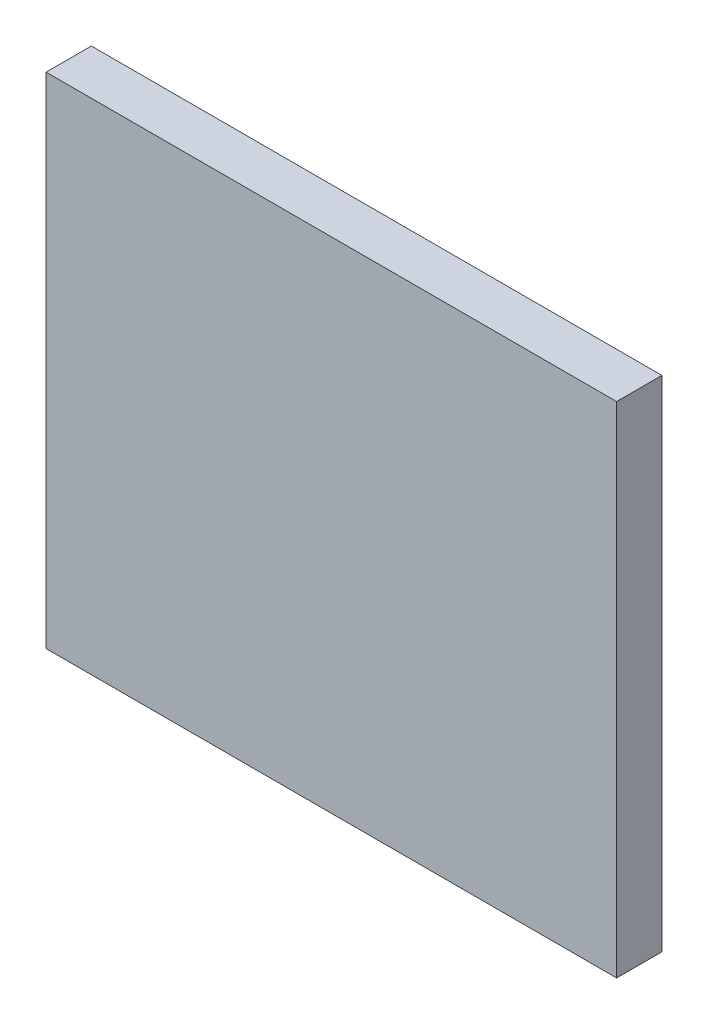
ISO-10303-21;
HEADER;
FILE_DESCRIPTION(('STEP AP214'),'2;1');
FILE_NAME('part.step','',(''),(''),'','','');
FILE_SCHEMA(('AUTOMOTIVE_DESIGN { 1 0 10303 214 1 1 1 1 }'));
ENDSEC;
DATA;
#1=APPLICATION_CONTEXT('core data for automotive mechanical design processes');
#2=APPLICATION_PROTOCOL_DEFINITION('international standard','automotive_design',2000,#1);
#3=PRODUCT_CONTEXT('',#1,'mechanical');
#4=PRODUCT('Part','Part','',(#3));
#5=PRODUCT_RELATED_PRODUCT_CATEGORY('part','',(#4));
#6=PRODUCT_DEFINITION_FORMATION('','',#4);
#7=PRODUCT_DEFINITION_CONTEXT('part definition',#1,'design');
#8=PRODUCT_DEFINITION('design','',#6,#7);
#9=PRODUCT_DEFINITION_SHAPE('','',#8);
#10=(LENGTH_UNIT() NAMED_UNIT(*) SI_UNIT(.MILLI.,.METRE.));
#11=(NAMED_UNIT(*) PLANE_ANGLE_UNIT() SI_UNIT($,.RADIAN.));
#12=(NAMED_UNIT(*) SI_UNIT($,.STERADIAN.) SOLID_ANGLE_UNIT());
#13=UNCERTAINTY_MEASURE_WITH_UNIT(LENGTH_MEASURE(1.E-05),#10,'distance_accuracy_value','');
#14=(GEOMETRIC_REPRESENTATION_CONTEXT(3) GLOBAL_UNCERTAINTY_ASSIGNED_CONTEXT((#13)) GLOBAL_UNIT_ASSIGNED_CONTEXT((#10,
#11,#12)) REPRESENTATION_CONTEXT('',''));
#15=CARTESIAN_POINT('',(0.,0.,0.));
#16=DIRECTION('',(0.,0.,1.));
#17=DIRECTION('',(1.,0.,0.));
#18=AXIS2_PLACEMENT_3D('',#15,#16,#17);
#19=CARTESIAN_POINT('',(-160.,-140.,25.4));
#20=DIRECTION('',(1.,0.,0.));
#21=DIRECTION('',(0.,0.,-1.));
#22=AXIS2_PLACEMENT_3D('',#19,#20,#21);
#23=PLANE('',#22);
#24=DIRECTION('',(0.,-1.,0.));
#25=VECTOR('',#24,1.);
#26=CARTESIAN_POINT('',(-160.,-140.,0.));
#27=LINE('',#26,#25);
#28=CARTESIAN_POINT('',(-160.,140.,0.));
#29=VERTEX_POINT('',#28);
#30=CARTESIAN_POINT('',(-160.,-140.,0.));
#31=VERTEX_POINT('',#30);
#32=EDGE_CURVE('E96',#29,#31,#27,.T.);
#33=ORIENTED_EDGE('',*,*,#32,.T.);
#34=DIRECTION('',(0.,0.,-1.));
#35=VECTOR('',#34,1.);
#36=CARTESIAN_POINT('',(-160.,-140.,25.4));
#37=LINE('',#36,#35);
#38=CARTESIAN_POINT('',(-160.,-140.,25.4));
#39=VERTEX_POINT('',#38);
#40=EDGE_CURVE('E11',#39,#31,#37,.T.);
#41=ORIENTED_EDGE('',*,*,#40,.F.);
#42=DIRECTION('',(0.,-1.,0.));
#43=VECTOR('',#42,1.);
#44=CARTESIAN_POINT('',(-160.,-140.,25.4));
#45=LINE('',#44,#43);
#46=CARTESIAN_POINT('',(-160.,140.,25.4));
#47=VERTEX_POINT('',#46);
#48=EDGE_CURVE('E84',#47,#39,#45,.T.);
#49=ORIENTED_EDGE('',*,*,#48,.F.);
#50=DIRECTION('',(0.,0.,-1.));
#51=VECTOR('',#50,1.);
#52=CARTESIAN_POINT('',(-160.,140.,25.4));
#53=LINE('',#52,#51);
#54=EDGE_CURVE('E92',#47,#29,#53,.T.);
#55=ORIENTED_EDGE('',*,*,#54,.T.);
#56=EDGE_LOOP('',(#33,#41,#49,#55));
#57=FACE_BOUND('',#56,.T.);
#58=ADVANCED_FACE('F33',(#57),#23,.F.);
#59=CARTESIAN_POINT('',(160.,-140.,25.4));
#60=DIRECTION('',(0.,1.,0.));
#61=DIRECTION('',(-1.,0.,0.));
#62=AXIS2_PLACEMENT_3D('',#59,#60,#61);
#63=PLANE('',#62);
#64=DIRECTION('',(1.,0.,0.));
#65=VECTOR('',#64,1.);
#66=CARTESIAN_POINT('',(160.,-140.,0.));
#67=LINE('',#66,#65);
#68=CARTESIAN_POINT('',(160.,-140.,0.));
#69=VERTEX_POINT('',#68);
#70=EDGE_CURVE('E88',#31,#69,#67,.T.);
#71=ORIENTED_EDGE('',*,*,#70,.T.);
#72=DIRECTION('',(0.,0.,-1.));
#73=VECTOR('',#72,1.);
#74=CARTESIAN_POINT('',(160.,-140.,25.4));
#75=LINE('',#74,#73);
#76=CARTESIAN_POINT('',(160.,-140.,25.4));
#77=VERTEX_POINT('',#76);
#78=EDGE_CURVE('E41',#77,#69,#75,.T.);
#79=ORIENTED_EDGE('',*,*,#78,.F.);
#80=DIRECTION('',(1.,0.,0.));
#81=VECTOR('',#80,1.);
#82=CARTESIAN_POINT('',(160.,-140.,25.4));
#83=LINE('',#82,#81);
#84=EDGE_CURVE('E79',#39,#77,#83,.T.);
#85=ORIENTED_EDGE('',*,*,#84,.F.);
#86=ORIENTED_EDGE('',*,*,#40,.T.);
#87=EDGE_LOOP('',(#71,#79,#85,#86));
#88=FACE_BOUND('',#87,.T.);
#89=ADVANCED_FACE('F87',(#88),#63,.F.);
#90=CARTESIAN_POINT('',(160.,-140.,25.4));
#91=DIRECTION('',(-1.,0.,0.));
#92=DIRECTION('',(0.,0.,1.));
#93=AXIS2_PLACEMENT_3D('',#90,#91,#92);
#94=PLANE('',#93);
#95=DIRECTION('',(0.,1.,0.));
#96=VECTOR('',#95,1.);
#97=CARTESIAN_POINT('',(160.,-140.,0.));
#98=LINE('',#97,#96);
#99=CARTESIAN_POINT('',(160.,140.,0.));
#100=VERTEX_POINT('',#99);
#101=EDGE_CURVE('E66',#69,#100,#98,.T.);
#102=ORIENTED_EDGE('',*,*,#101,.T.);
#103=DIRECTION('',(0.,0.,-1.));
#104=VECTOR('',#103,1.);
#105=CARTESIAN_POINT('',(160.,140.,25.4));
#106=LINE('',#105,#104);
#107=CARTESIAN_POINT('',(160.,140.,25.4));
#108=VERTEX_POINT('',#107);
#109=EDGE_CURVE('E89',#108,#100,#106,.T.);
#110=ORIENTED_EDGE('',*,*,#109,.F.);
#111=DIRECTION('',(0.,1.,0.));
#112=VECTOR('',#111,1.);
#113=CARTESIAN_POINT('',(160.,-140.,25.4));
#114=LINE('',#113,#112);
#115=EDGE_CURVE('E82',#77,#108,#114,.T.);
#116=ORIENTED_EDGE('',*,*,#115,.F.);
#117=ORIENTED_EDGE('',*,*,#78,.T.);
#118=EDGE_LOOP('',(#102,#110,#116,#117));
#119=FACE_BOUND('',#118,.T.);
#120=ADVANCED_FACE('F90',(#119),#94,.F.);
#121=CARTESIAN_POINT('',(160.,140.,25.4));
#122=DIRECTION('',(0.,-1.,0.));
#123=DIRECTION('',(1.,0.,0.));
#124=AXIS2_PLACEMENT_3D('',#121,#122,#123);
#125=PLANE('',#124);
#126=DIRECTION('',(-1.,0.,0.));
#127=VECTOR('',#126,1.);
#128=CARTESIAN_POINT('',(160.,140.,0.));
#129=LINE('',#128,#127);
#130=EDGE_CURVE('E72',#100,#29,#129,.T.);
#131=ORIENTED_EDGE('',*,*,#130,.T.);
#132=ORIENTED_EDGE('',*,*,#54,.F.);
#133=DIRECTION('',(-1.,0.,0.));
#134=VECTOR('',#133,1.);
#135=CARTESIAN_POINT('',(160.,140.,25.4));
#136=LINE('',#135,#134);
#137=EDGE_CURVE('E49',#108,#47,#136,.T.);
#138=ORIENTED_EDGE('',*,*,#137,.F.);
#139=ORIENTED_EDGE('',*,*,#109,.T.);
#140=EDGE_LOOP('',(#131,#132,#138,#139));
#141=FACE_BOUND('',#140,.T.);
#142=ADVANCED_FACE('F103',(#141),#125,.F.);
#143=CARTESIAN_POINT('',(0.,0.,25.4));
#144=DIRECTION('',(0.,0.,1.));
#145=DIRECTION('',(1.,0.,0.));
#146=AXIS2_PLACEMENT_3D('',#143,#144,#145);
#147=PLANE('',#146);
#148=ORIENTED_EDGE('',*,*,#48,.T.);
#149=ORIENTED_EDGE('',*,*,#84,.T.);
#150=ORIENTED_EDGE('',*,*,#115,.T.);
#151=ORIENTED_EDGE('',*,*,#137,.T.);
#152=EDGE_LOOP('',(#148,#149,#150,#151));
#153=FACE_BOUND('',#152,.T.);
#154=ADVANCED_FACE('F80',(#153),#147,.T.);
#155=CARTESIAN_POINT('',(0.,0.,0.));
#156=DIRECTION('',(0.,0.,1.));
#157=DIRECTION('',(1.,0.,0.));
#158=AXIS2_PLACEMENT_3D('',#155,#156,#157);
#159=PLANE('',#158);
#160=ORIENTED_EDGE('',*,*,#32,.F.);
#161=ORIENTED_EDGE('',*,*,#130,.F.);
#162=ORIENTED_EDGE('',*,*,#101,.F.);
#163=ORIENTED_EDGE('',*,*,#70,.F.);
#164=EDGE_LOOP('',(#160,#161,#162,#163));
#165=FACE_BOUND('',#164,.T.);
#166=ADVANCED_FACE('F106',(#165),#159,.F.);
#167=CLOSED_SHELL('',(#58,#89,#120,#142,#154,#166));
#168=MANIFOLD_SOLID_BREP('B2',#167);
#169=ADVANCED_BREP_SHAPE_REPRESENTATION('',(#18,#168),#14);
#170=SHAPE_DEFINITION_REPRESENTATION(#9,#169);
ENDSEC;
END-ISO-10303-21;
